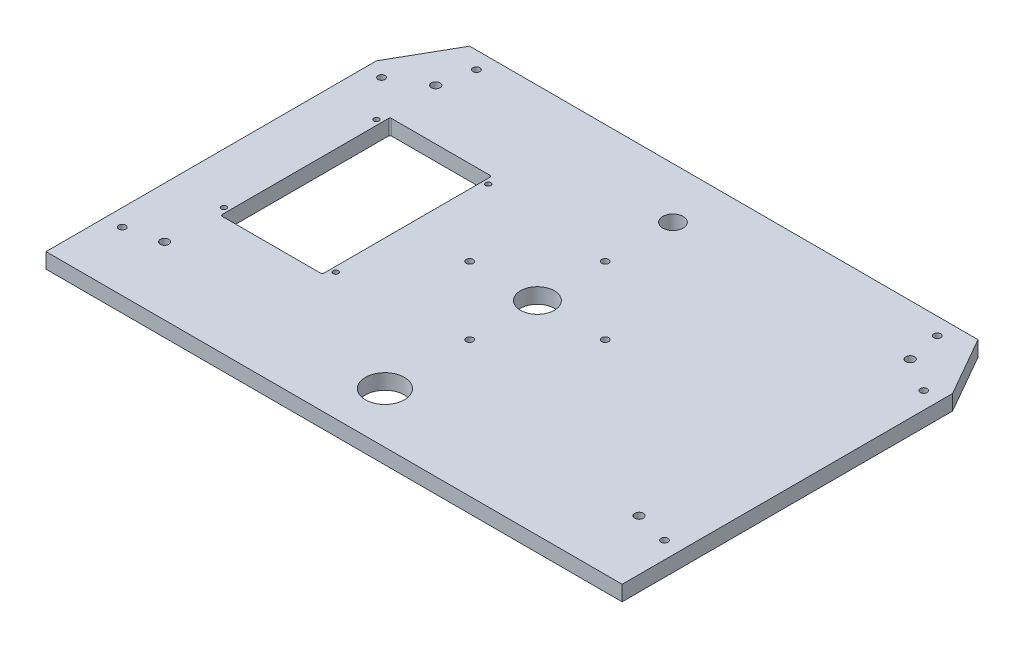
ISO-10303-21;
HEADER;
FILE_DESCRIPTION(('STEP AP214'),'2;1');
FILE_NAME('part.step','',(''),(''),'','','');
FILE_SCHEMA(('AUTOMOTIVE_DESIGN { 1 0 10303 214 1 1 1 1 }'));
ENDSEC;
DATA;
#1=APPLICATION_CONTEXT('core data for automotive mechanical design processes');
#2=APPLICATION_PROTOCOL_DEFINITION('international standard','automotive_design',2000,#1);
#3=PRODUCT_CONTEXT('',#1,'mechanical');
#4=PRODUCT('Part','Part','',(#3));
#5=PRODUCT_RELATED_PRODUCT_CATEGORY('part','',(#4));
#6=PRODUCT_DEFINITION_FORMATION('','',#4);
#7=PRODUCT_DEFINITION_CONTEXT('part definition',#1,'design');
#8=PRODUCT_DEFINITION('design','',#6,#7);
#9=PRODUCT_DEFINITION_SHAPE('','',#8);
#10=(LENGTH_UNIT() NAMED_UNIT(*) SI_UNIT(.MILLI.,.METRE.));
#11=(NAMED_UNIT(*) PLANE_ANGLE_UNIT() SI_UNIT($,.RADIAN.));
#12=(NAMED_UNIT(*) SI_UNIT($,.STERADIAN.) SOLID_ANGLE_UNIT());
#13=UNCERTAINTY_MEASURE_WITH_UNIT(LENGTH_MEASURE(1.E-05),#10,'distance_accuracy_value','');
#14=(GEOMETRIC_REPRESENTATION_CONTEXT(3) GLOBAL_UNCERTAINTY_ASSIGNED_CONTEXT((#13)) GLOBAL_UNIT_ASSIGNED_CONTEXT((#10,
#11,#12)) REPRESENTATION_CONTEXT('',''));
#15=CARTESIAN_POINT('',(0.,0.,0.));
#16=DIRECTION('',(0.,0.,1.));
#17=DIRECTION('',(1.,0.,0.));
#18=AXIS2_PLACEMENT_3D('',#15,#16,#17);
#19=CARTESIAN_POINT('',(-170.,-9.,0.));
#20=DIRECTION('',(-1.,0.,0.));
#21=DIRECTION('',(0.,0.,1.));
#22=AXIS2_PLACEMENT_3D('',#19,#20,#21);
#23=PLANE('',#22);
#24=DIRECTION('',(0.,0.,1.));
#25=VECTOR('',#24,1.);
#26=CARTESIAN_POINT('',(-170.,0.,0.));
#27=LINE('',#26,#25);
#28=CARTESIAN_POINT('',(-170.,0.,-75.));
#29=VERTEX_POINT('',#28);
#30=CARTESIAN_POINT('',(-170.,0.,120.));
#31=VERTEX_POINT('',#30);
#32=EDGE_CURVE('E371',#29,#31,#27,.T.);
#33=ORIENTED_EDGE('',*,*,#32,.F.);
#34=DIRECTION('',(0.,1.,0.));
#35=VECTOR('',#34,1.);
#36=CARTESIAN_POINT('',(-170.,-9.,-75.));
#37=LINE('',#36,#35);
#38=CARTESIAN_POINT('',(-170.,-9.,-75.));
#39=VERTEX_POINT('',#38);
#40=EDGE_CURVE('E13',#39,#29,#37,.T.);
#41=ORIENTED_EDGE('',*,*,#40,.F.);
#42=DIRECTION('',(0.,0.,1.));
#43=VECTOR('',#42,1.);
#44=CARTESIAN_POINT('',(-170.,-9.,0.));
#45=LINE('',#44,#43);
#46=CARTESIAN_POINT('',(-170.,-9.,120.));
#47=VERTEX_POINT('',#46);
#48=EDGE_CURVE('E343',#39,#47,#45,.T.);
#49=ORIENTED_EDGE('',*,*,#48,.T.);
#50=DIRECTION('',(0.,1.,0.));
#51=VECTOR('',#50,1.);
#52=CARTESIAN_POINT('',(-170.,-9.,120.));
#53=LINE('',#52,#51);
#54=EDGE_CURVE('E89',#47,#31,#53,.T.);
#55=ORIENTED_EDGE('',*,*,#54,.T.);
#56=EDGE_LOOP('',(#33,#41,#49,#55));
#57=FACE_BOUND('',#56,.T.);
#58=ADVANCED_FACE('F85',(#57),#23,.T.);
#59=CARTESIAN_POINT('',(-160.461538461538,-9.,-91.6923076923079));
#60=DIRECTION('',(0.868243142124459,0.,0.496138938356835));
#61=DIRECTION('',(0.496138938356835,0.,-0.868243142124459));
#62=AXIS2_PLACEMENT_3D('',#59,#60,#61);
#63=PLANE('',#62);
#64=DIRECTION('',(0.496138938356835,0.,-0.868243142124459));
#65=VECTOR('',#64,1.);
#66=CARTESIAN_POINT('',(-160.461538461538,0.,-91.6923076923079));
#67=LINE('',#66,#65);
#68=CARTESIAN_POINT('',(-150.,0.,-110.));
#69=VERTEX_POINT('',#68);
#70=EDGE_CURVE('E386',#29,#69,#67,.T.);
#71=ORIENTED_EDGE('',*,*,#70,.T.);
#72=DIRECTION('',(0.,1.,0.));
#73=VECTOR('',#72,1.);
#74=CARTESIAN_POINT('',(-150.,-9.,-110.));
#75=LINE('',#74,#73);
#76=CARTESIAN_POINT('',(-150.,-9.,-110.));
#77=VERTEX_POINT('',#76);
#78=EDGE_CURVE('E94',#77,#69,#75,.T.);
#79=ORIENTED_EDGE('',*,*,#78,.F.);
#80=DIRECTION('',(0.496138938356835,0.,-0.868243142124459));
#81=VECTOR('',#80,1.);
#82=CARTESIAN_POINT('',(-160.461538461538,-9.,-91.6923076923079));
#83=LINE('',#82,#81);
#84=EDGE_CURVE('E358',#39,#77,#83,.T.);
#85=ORIENTED_EDGE('',*,*,#84,.F.);
#86=ORIENTED_EDGE('',*,*,#40,.T.);
#87=EDGE_LOOP('',(#71,#79,#85,#86));
#88=FACE_BOUND('',#87,.T.);
#89=ADVANCED_FACE('F414',(#88),#63,.F.);
#90=CARTESIAN_POINT('',(0.,-9.,-110.));
#91=DIRECTION('',(0.,0.,-1.));
#92=DIRECTION('',(-1.,0.,0.));
#93=AXIS2_PLACEMENT_3D('',#90,#91,#92);
#94=PLANE('',#93);
#95=DIRECTION('',(-1.,0.,0.));
#96=VECTOR('',#95,1.);
#97=CARTESIAN_POINT('',(0.,0.,-110.));
#98=LINE('',#97,#96);
#99=CARTESIAN_POINT('',(150.,0.,-110.));
#100=VERTEX_POINT('',#99);
#101=EDGE_CURVE('E383',#100,#69,#98,.T.);
#102=ORIENTED_EDGE('',*,*,#101,.F.);
#103=DIRECTION('',(0.,1.,0.));
#104=VECTOR('',#103,1.);
#105=CARTESIAN_POINT('',(150.,-9.,-110.));
#106=LINE('',#105,#104);
#107=CARTESIAN_POINT('',(150.,-9.,-110.));
#108=VERTEX_POINT('',#107);
#109=EDGE_CURVE('E395',#108,#100,#106,.T.);
#110=ORIENTED_EDGE('',*,*,#109,.F.);
#111=DIRECTION('',(-1.,0.,0.));
#112=VECTOR('',#111,1.);
#113=CARTESIAN_POINT('',(0.,-9.,-110.));
#114=LINE('',#113,#112);
#115=EDGE_CURVE('E355',#108,#77,#114,.T.);
#116=ORIENTED_EDGE('',*,*,#115,.T.);
#117=ORIENTED_EDGE('',*,*,#78,.T.);
#118=EDGE_LOOP('',(#102,#110,#116,#117));
#119=FACE_BOUND('',#118,.T.);
#120=ADVANCED_FACE('F427',(#119),#94,.T.);
#121=CARTESIAN_POINT('',(160.461538461538,-9.,-91.6923076923079));
#122=DIRECTION('',(0.868243142124459,0.,-0.496138938356835));
#123=DIRECTION('',(-0.496138938356835,0.,-0.868243142124459));
#124=AXIS2_PLACEMENT_3D('',#121,#122,#123);
#125=PLANE('',#124);
#126=DIRECTION('',(-0.496138938356835,0.,-0.868243142124459));
#127=VECTOR('',#126,1.);
#128=CARTESIAN_POINT('',(160.461538461538,0.,-91.6923076923079));
#129=LINE('',#128,#127);
#130=CARTESIAN_POINT('',(170.,0.,-75.));
#131=VERTEX_POINT('',#130);
#132=EDGE_CURVE('E380',#131,#100,#129,.T.);
#133=ORIENTED_EDGE('',*,*,#132,.F.);
#134=DIRECTION('',(0.,1.,0.));
#135=VECTOR('',#134,1.);
#136=CARTESIAN_POINT('',(170.,-9.,-75.));
#137=LINE('',#136,#135);
#138=CARTESIAN_POINT('',(170.,-9.,-75.));
#139=VERTEX_POINT('',#138);
#140=EDGE_CURVE('E397',#139,#131,#137,.T.);
#141=ORIENTED_EDGE('',*,*,#140,.F.);
#142=DIRECTION('',(-0.496138938356835,0.,-0.868243142124459));
#143=VECTOR('',#142,1.);
#144=CARTESIAN_POINT('',(160.461538461538,-9.,-91.6923076923079));
#145=LINE('',#144,#143);
#146=EDGE_CURVE('E352',#139,#108,#145,.T.);
#147=ORIENTED_EDGE('',*,*,#146,.T.);
#148=ORIENTED_EDGE('',*,*,#109,.T.);
#149=EDGE_LOOP('',(#133,#141,#147,#148));
#150=FACE_BOUND('',#149,.T.);
#151=ADVANCED_FACE('F425',(#150),#125,.T.);
#152=CARTESIAN_POINT('',(170.,-9.,0.));
#153=DIRECTION('',(1.,0.,0.));
#154=DIRECTION('',(0.,0.,-1.));
#155=AXIS2_PLACEMENT_3D('',#152,#153,#154);
#156=PLANE('',#155);
#157=DIRECTION('',(0.,0.,-1.));
#158=VECTOR('',#157,1.);
#159=CARTESIAN_POINT('',(170.,0.,0.));
#160=LINE('',#159,#158);
#161=CARTESIAN_POINT('',(170.,0.,120.));
#162=VERTEX_POINT('',#161);
#163=EDGE_CURVE('E377',#162,#131,#160,.T.);
#164=ORIENTED_EDGE('',*,*,#163,.F.);
#165=DIRECTION('',(0.,1.,0.));
#166=VECTOR('',#165,1.);
#167=CARTESIAN_POINT('',(170.,-9.,120.));
#168=LINE('',#167,#166);
#169=CARTESIAN_POINT('',(170.,-9.,120.));
#170=VERTEX_POINT('',#169);
#171=EDGE_CURVE('E398',#170,#162,#168,.T.);
#172=ORIENTED_EDGE('',*,*,#171,.F.);
#173=DIRECTION('',(0.,0.,-1.));
#174=VECTOR('',#173,1.);
#175=CARTESIAN_POINT('',(170.,-9.,0.));
#176=LINE('',#175,#174);
#177=EDGE_CURVE('E349',#170,#139,#176,.T.);
#178=ORIENTED_EDGE('',*,*,#177,.T.);
#179=ORIENTED_EDGE('',*,*,#140,.T.);
#180=EDGE_LOOP('',(#164,#172,#178,#179));
#181=FACE_BOUND('',#180,.T.);
#182=ADVANCED_FACE('F422',(#181),#156,.T.);
#183=CARTESIAN_POINT('',(140.,-9.,80.));
#184=DIRECTION('',(0.,1.,0.));
#185=DIRECTION('',(0.,0.,1.));
#186=AXIS2_PLACEMENT_3D('',#183,#184,#185);
#187=CYLINDRICAL_SURFACE('',#186,2.54999999999999);
#188=CARTESIAN_POINT('',(140.,-9.,80.));
#189=DIRECTION('',(0.,1.,0.));
#190=DIRECTION('',(0.,0.,1.));
#191=AXIS2_PLACEMENT_3D('',#188,#189,#190);
#192=CIRCLE('',#191,2.54999999999999);
#193=CARTESIAN_POINT('',(140.,-9.,82.55));
#194=VERTEX_POINT('',#193);
#195=EDGE_CURVE('E360',#194,#194,#192,.T.);
#196=ORIENTED_EDGE('',*,*,#195,.F.);
#197=EDGE_LOOP('',(#196));
#198=FACE_BOUND('',#197,.T.);
#199=CARTESIAN_POINT('',(140.,0.,80.));
#200=DIRECTION('',(0.,1.,0.));
#201=DIRECTION('',(0.,0.,1.));
#202=AXIS2_PLACEMENT_3D('',#199,#200,#201);
#203=CIRCLE('',#202,2.54999999999999);
#204=CARTESIAN_POINT('',(140.,0.,82.55));
#205=VERTEX_POINT('',#204);
#206=EDGE_CURVE('E389',#205,#205,#203,.T.);
#207=ORIENTED_EDGE('',*,*,#206,.T.);
#208=EDGE_LOOP('',(#207));
#209=FACE_BOUND('',#208,.T.);
#210=ADVANCED_FACE('F451',(#198,#209),#187,.F.);
#211=CARTESIAN_POINT('',(0.,-9.,120.));
#212=DIRECTION('',(0.,0.,1.));
#213=DIRECTION('',(1.,0.,0.));
#214=AXIS2_PLACEMENT_3D('',#211,#212,#213);
#215=PLANE('',#214);
#216=DIRECTION('',(1.,0.,0.));
#217=VECTOR('',#216,1.);
#218=CARTESIAN_POINT('',(0.,0.,120.));
#219=LINE('',#218,#217);
#220=EDGE_CURVE('E374',#31,#162,#219,.T.);
#221=ORIENTED_EDGE('',*,*,#220,.F.);
#222=ORIENTED_EDGE('',*,*,#54,.F.);
#223=DIRECTION('',(1.,0.,0.));
#224=VECTOR('',#223,1.);
#225=CARTESIAN_POINT('',(0.,-9.,120.));
#226=LINE('',#225,#224);
#227=EDGE_CURVE('E346',#47,#170,#226,.T.);
#228=ORIENTED_EDGE('',*,*,#227,.T.);
#229=ORIENTED_EDGE('',*,*,#171,.T.);
#230=EDGE_LOOP('',(#221,#222,#228,#229));
#231=FACE_BOUND('',#230,.T.);
#232=ADVANCED_FACE('F406',(#231),#215,.T.);
#233=CARTESIAN_POINT('',(-140.,-9.,-80.));
#234=DIRECTION('',(0.,1.,0.));
#235=DIRECTION('',(0.,0.,1.));
#236=AXIS2_PLACEMENT_3D('',#233,#234,#235);
#237=CYLINDRICAL_SURFACE('',#236,2.54999999999999);
#238=CARTESIAN_POINT('',(-140.,-9.,-80.));
#239=DIRECTION('',(0.,1.,0.));
#240=DIRECTION('',(0.,0.,1.));
#241=AXIS2_PLACEMENT_3D('',#238,#239,#240);
#242=CIRCLE('',#241,2.54999999999999);
#243=CARTESIAN_POINT('',(-140.,-9.,-77.45));
#244=VERTEX_POINT('',#243);
#245=EDGE_CURVE('E339',#244,#244,#242,.T.);
#246=ORIENTED_EDGE('',*,*,#245,.F.);
#247=EDGE_LOOP('',(#246));
#248=FACE_BOUND('',#247,.T.);
#249=CARTESIAN_POINT('',(-140.,0.,-80.));
#250=DIRECTION('',(0.,1.,0.));
#251=DIRECTION('',(0.,0.,1.));
#252=AXIS2_PLACEMENT_3D('',#249,#250,#251);
#253=CIRCLE('',#252,2.54999999999999);
#254=CARTESIAN_POINT('',(-140.,0.,-77.45));
#255=VERTEX_POINT('',#254);
#256=EDGE_CURVE('E368',#255,#255,#253,.T.);
#257=ORIENTED_EDGE('',*,*,#256,.T.);
#258=EDGE_LOOP('',(#257));
#259=FACE_BOUND('',#258,.T.);
#260=ADVANCED_FACE('F442',(#248,#259),#237,.F.);
#261=CARTESIAN_POINT('',(-140.,-9.,80.));
#262=DIRECTION('',(0.,1.,0.));
#263=DIRECTION('',(0.,0.,1.));
#264=AXIS2_PLACEMENT_3D('',#261,#262,#263);
#265=CYLINDRICAL_SURFACE('',#264,2.54999999999999);
#266=CARTESIAN_POINT('',(-140.,-9.,80.));
#267=DIRECTION('',(0.,1.,0.));
#268=DIRECTION('',(0.,0.,1.));
#269=AXIS2_PLACEMENT_3D('',#266,#267,#268);
#270=CIRCLE('',#269,2.54999999999999);
#271=CARTESIAN_POINT('',(-140.,-9.,82.55));
#272=VERTEX_POINT('',#271);
#273=EDGE_CURVE('E336',#272,#272,#270,.F.);
#274=ORIENTED_EDGE('',*,*,#273,.T.);
#275=EDGE_LOOP('',(#274));
#276=FACE_BOUND('',#275,.T.);
#277=CARTESIAN_POINT('',(-140.,0.,80.));
#278=DIRECTION('',(0.,1.,0.));
#279=DIRECTION('',(0.,0.,1.));
#280=AXIS2_PLACEMENT_3D('',#277,#278,#279);
#281=CIRCLE('',#280,2.54999999999999);
#282=CARTESIAN_POINT('',(-140.,0.,82.55));
#283=VERTEX_POINT('',#282);
#284=EDGE_CURVE('E335',#283,#283,#281,.F.);
#285=ORIENTED_EDGE('',*,*,#284,.F.);
#286=EDGE_LOOP('',(#285));
#287=FACE_BOUND('',#286,.T.);
#288=ADVANCED_FACE('F87',(#276,#287),#265,.F.);
#289=CARTESIAN_POINT('',(140.,-9.,-80.));
#290=DIRECTION('',(0.,1.,0.));
#291=DIRECTION('',(0.,0.,1.));
#292=AXIS2_PLACEMENT_3D('',#289,#290,#291);
#293=CYLINDRICAL_SURFACE('',#292,2.54999999999999);
#294=CARTESIAN_POINT('',(140.,-9.,-80.));
#295=DIRECTION('',(0.,1.,0.));
#296=DIRECTION('',(0.,0.,1.));
#297=AXIS2_PLACEMENT_3D('',#294,#295,#296);
#298=CIRCLE('',#297,2.54999999999999);
#299=CARTESIAN_POINT('',(140.,-9.,-77.45));
#300=VERTEX_POINT('',#299);
#301=EDGE_CURVE('E363',#300,#300,#298,.F.);
#302=ORIENTED_EDGE('',*,*,#301,.T.);
#303=EDGE_LOOP('',(#302));
#304=FACE_BOUND('',#303,.T.);
#305=CARTESIAN_POINT('',(140.,0.,-80.));
#306=DIRECTION('',(0.,1.,0.));
#307=DIRECTION('',(0.,0.,1.));
#308=AXIS2_PLACEMENT_3D('',#305,#306,#307);
#309=CIRCLE('',#308,2.54999999999999);
#310=CARTESIAN_POINT('',(140.,0.,-77.45));
#311=VERTEX_POINT('',#310);
#312=EDGE_CURVE('E340',#311,#311,#309,.F.);
#313=ORIENTED_EDGE('',*,*,#312,.F.);
#314=EDGE_LOOP('',(#313));
#315=FACE_BOUND('',#314,.T.);
#316=ADVANCED_FACE('F449',(#304,#315),#293,.F.);
#317=CARTESIAN_POINT('',(0.,-9.,0.));
#318=DIRECTION('',(0.,1.,0.));
#319=DIRECTION('',(0.,0.,1.));
#320=AXIS2_PLACEMENT_3D('',#317,#318,#319);
#321=PLANE('',#320);
#322=CARTESIAN_POINT('',(-74.,-9.,45.));
#323=DIRECTION('',(0.,1.,0.));
#324=DIRECTION('',(0.,0.,1.));
#325=AXIS2_PLACEMENT_3D('',#322,#323,#324);
#326=CIRCLE('',#325,1.54999999999999);
#327=CARTESIAN_POINT('',(-74.,-9.,46.55));
#328=VERTEX_POINT('',#327);
#329=EDGE_CURVE('E819',#328,#328,#326,.T.);
#330=ORIENTED_EDGE('',*,*,#329,.T.);
#331=EDGE_LOOP('',(#330));
#332=FACE_BOUND('',#331,.T.);
#333=CARTESIAN_POINT('',(-74.,-9.,-45.));
#334=DIRECTION('',(0.,1.,0.));
#335=DIRECTION('',(0.,0.,1.));
#336=AXIS2_PLACEMENT_3D('',#333,#334,#335);
#337=CIRCLE('',#336,1.54999999999999);
#338=CARTESIAN_POINT('',(-74.,-9.,-43.45));
#339=VERTEX_POINT('',#338);
#340=EDGE_CURVE('E822',#339,#339,#337,.T.);
#341=ORIENTED_EDGE('',*,*,#340,.T.);
#342=EDGE_LOOP('',(#341));
#343=FACE_BOUND('',#342,.T.);
#344=CARTESIAN_POINT('',(-140.,-9.,-45.));
#345=DIRECTION('',(0.,1.,0.));
#346=DIRECTION('',(0.,0.,1.));
#347=AXIS2_PLACEMENT_3D('',#344,#345,#346);
#348=CIRCLE('',#347,1.54999999999999);
#349=CARTESIAN_POINT('',(-140.,-9.,-43.45));
#350=VERTEX_POINT('',#349);
#351=EDGE_CURVE('E830',#350,#350,#348,.T.);
#352=ORIENTED_EDGE('',*,*,#351,.T.);
#353=EDGE_LOOP('',(#352));
#354=FACE_BOUND('',#353,.T.);
#355=CARTESIAN_POINT('',(-140.,-9.,45.));
#356=DIRECTION('',(0.,1.,0.));
#357=DIRECTION('',(0.,0.,1.));
#358=AXIS2_PLACEMENT_3D('',#355,#356,#357);
#359=CIRCLE('',#358,1.54999999999999);
#360=CARTESIAN_POINT('',(-140.,-9.,46.55));
#361=VERTEX_POINT('',#360);
#362=EDGE_CURVE('E836',#361,#361,#359,.T.);
#363=ORIENTED_EDGE('',*,*,#362,.T.);
#364=EDGE_LOOP('',(#363));
#365=FACE_BOUND('',#364,.T.);
#366=DIRECTION('',(0.,0.,-1.));
#367=VECTOR('',#366,1.);
#368=CARTESIAN_POINT('',(-77.,-9.,0.));
#369=LINE('',#368,#367);
#370=CARTESIAN_POINT('',(-77.,-9.,49.));
#371=VERTEX_POINT('',#370);
#372=CARTESIAN_POINT('',(-77.,-9.,-49.));
#373=VERTEX_POINT('',#372);
#374=EDGE_CURVE('E221',#371,#373,#369,.T.);
#375=ORIENTED_EDGE('',*,*,#374,.T.);
#376=CARTESIAN_POINT('',(-78.,-9.,-49.));
#377=DIRECTION('',(0.,1.,0.));
#378=DIRECTION('',(0.,0.,1.));
#379=AXIS2_PLACEMENT_3D('',#376,#377,#378);
#380=CIRCLE('',#379,1.);
#381=CARTESIAN_POINT('',(-78.,-9.,-50.));
#382=VERTEX_POINT('',#381);
#383=EDGE_CURVE('E223',#373,#382,#380,.T.);
#384=ORIENTED_EDGE('',*,*,#383,.T.);
#385=DIRECTION('',(-1.,0.,0.));
#386=VECTOR('',#385,1.);
#387=CARTESIAN_POINT('',(0.,-9.,-50.));
#388=LINE('',#387,#386);
#389=CARTESIAN_POINT('',(-136.,-9.,-50.));
#390=VERTEX_POINT('',#389);
#391=EDGE_CURVE('E210',#382,#390,#388,.T.);
#392=ORIENTED_EDGE('',*,*,#391,.T.);
#393=CARTESIAN_POINT('',(-136.,-9.,-49.));
#394=DIRECTION('',(0.,1.,0.));
#395=DIRECTION('',(0.,0.,1.));
#396=AXIS2_PLACEMENT_3D('',#393,#394,#395);
#397=CIRCLE('',#396,1.);
#398=CARTESIAN_POINT('',(-137.,-9.,-49.));
#399=VERTEX_POINT('',#398);
#400=EDGE_CURVE('E102',#390,#399,#397,.T.);
#401=ORIENTED_EDGE('',*,*,#400,.T.);
#402=DIRECTION('',(0.,0.,-1.));
#403=VECTOR('',#402,1.);
#404=CARTESIAN_POINT('',(-137.,-9.,0.));
#405=LINE('',#404,#403);
#406=CARTESIAN_POINT('',(-137.,-9.,49.));
#407=VERTEX_POINT('',#406);
#408=EDGE_CURVE('E188',#407,#399,#405,.T.);
#409=ORIENTED_EDGE('',*,*,#408,.F.);
#410=CARTESIAN_POINT('',(-136.,-9.,49.));
#411=DIRECTION('',(0.,1.,0.));
#412=DIRECTION('',(0.,0.,1.));
#413=AXIS2_PLACEMENT_3D('',#410,#411,#412);
#414=CIRCLE('',#413,1.);
#415=CARTESIAN_POINT('',(-136.,-9.,50.));
#416=VERTEX_POINT('',#415);
#417=EDGE_CURVE('E196',#416,#407,#414,.F.);
#418=ORIENTED_EDGE('',*,*,#417,.F.);
#419=DIRECTION('',(-1.,0.,0.));
#420=VECTOR('',#419,1.);
#421=CARTESIAN_POINT('',(0.,-9.,50.));
#422=LINE('',#421,#420);
#423=CARTESIAN_POINT('',(-78.,-9.,50.));
#424=VERTEX_POINT('',#423);
#425=EDGE_CURVE('E216',#424,#416,#422,.T.);
#426=ORIENTED_EDGE('',*,*,#425,.F.);
#427=CARTESIAN_POINT('',(-78.,-9.,49.));
#428=DIRECTION('',(0.,1.,0.));
#429=DIRECTION('',(0.,0.,1.));
#430=AXIS2_PLACEMENT_3D('',#427,#428,#429);
#431=CIRCLE('',#430,1.);
#432=EDGE_CURVE('E218',#424,#371,#431,.T.);
#433=ORIENTED_EDGE('',*,*,#432,.T.);
#434=EDGE_LOOP('',(#375,#384,#392,#401,#409,#418,#426,#433));
#435=FACE_BOUND('',#434,.T.);
#436=CARTESIAN_POINT('',(-136.,-9.,-100.));
#437=DIRECTION('',(0.,1.,0.));
#438=DIRECTION('',(0.,0.,1.));
#439=AXIS2_PLACEMENT_3D('',#436,#437,#438);
#440=CIRCLE('',#439,2.04999999999999);
#441=CARTESIAN_POINT('',(-136.,-9.,-97.95));
#442=VERTEX_POINT('',#441);
#443=EDGE_CURVE('E290',#442,#442,#440,.T.);
#444=ORIENTED_EDGE('',*,*,#443,.T.);
#445=EDGE_LOOP('',(#444));
#446=FACE_BOUND('',#445,.T.);
#447=CARTESIAN_POINT('',(-160.,-9.,-68.));
#448=DIRECTION('',(0.,1.,0.));
#449=DIRECTION('',(0.,0.,1.));
#450=AXIS2_PLACEMENT_3D('',#447,#448,#449);
#451=CIRCLE('',#450,2.04999999999999);
#452=CARTESIAN_POINT('',(-160.,-9.,-65.95));
#453=VERTEX_POINT('',#452);
#454=EDGE_CURVE('E287',#453,#453,#451,.T.);
#455=ORIENTED_EDGE('',*,*,#454,.T.);
#456=EDGE_LOOP('',(#455));
#457=FACE_BOUND('',#456,.T.);
#458=CARTESIAN_POINT('',(-160.,-9.,85.));
#459=DIRECTION('',(0.,1.,0.));
#460=DIRECTION('',(0.,0.,1.));
#461=AXIS2_PLACEMENT_3D('',#458,#459,#460);
#462=CIRCLE('',#461,2.04999999999999);
#463=CARTESIAN_POINT('',(-160.,-9.,87.05));
#464=VERTEX_POINT('',#463);
#465=EDGE_CURVE('E284',#464,#464,#462,.T.);
#466=ORIENTED_EDGE('',*,*,#465,.T.);
#467=EDGE_LOOP('',(#466));
#468=FACE_BOUND('',#467,.T.);
#469=CARTESIAN_POINT('',(136.,-9.,-100.));
#470=DIRECTION('',(0.,1.,0.));
#471=DIRECTION('',(0.,0.,1.));
#472=AXIS2_PLACEMENT_3D('',#469,#470,#471);
#473=CIRCLE('',#472,2.04999999999999);
#474=CARTESIAN_POINT('',(136.,-9.,-97.95));
#475=VERTEX_POINT('',#474);
#476=EDGE_CURVE('E281',#475,#475,#473,.T.);
#477=ORIENTED_EDGE('',*,*,#476,.T.);
#478=EDGE_LOOP('',(#477));
#479=FACE_BOUND('',#478,.T.);
#480=CARTESIAN_POINT('',(160.,-9.,-68.));
#481=DIRECTION('',(0.,1.,0.));
#482=DIRECTION('',(0.,0.,1.));
#483=AXIS2_PLACEMENT_3D('',#480,#481,#482);
#484=CIRCLE('',#483,2.04999999999999);
#485=CARTESIAN_POINT('',(160.,-9.,-65.95));
#486=VERTEX_POINT('',#485);
#487=EDGE_CURVE('E278',#486,#486,#484,.T.);
#488=ORIENTED_EDGE('',*,*,#487,.T.);
#489=EDGE_LOOP('',(#488));
#490=FACE_BOUND('',#489,.T.);
#491=CARTESIAN_POINT('',(160.,-9.,85.));
#492=DIRECTION('',(0.,1.,0.));
#493=DIRECTION('',(0.,0.,1.));
#494=AXIS2_PLACEMENT_3D('',#491,#492,#493);
#495=CIRCLE('',#494,2.04999999999999);
#496=CARTESIAN_POINT('',(160.,-9.,87.05));
#497=VERTEX_POINT('',#496);
#498=EDGE_CURVE('E270',#497,#497,#495,.T.);
#499=ORIENTED_EDGE('',*,*,#498,.T.);
#500=EDGE_LOOP('',(#499));
#501=FACE_BOUND('',#500,.T.);
#502=CARTESIAN_POINT('',(40.,-9.,0.));
#503=DIRECTION('',(0.,1.,0.));
#504=DIRECTION('',(0.,0.,1.));
#505=AXIS2_PLACEMENT_3D('',#502,#503,#504);
#506=CIRCLE('',#505,2.05);
#507=CARTESIAN_POINT('',(40.,-9.,2.05));
#508=VERTEX_POINT('',#507);
#509=EDGE_CURVE('E332',#508,#508,#506,.T.);
#510=ORIENTED_EDGE('',*,*,#509,.T.);
#511=EDGE_LOOP('',(#510));
#512=FACE_BOUND('',#511,.T.);
#513=CARTESIAN_POINT('',(0.,-9.,-80.));
#514=DIRECTION('',(0.,1.,0.));
#515=DIRECTION('',(0.,0.,1.));
#516=AXIS2_PLACEMENT_3D('',#513,#514,#515);
#517=CIRCLE('',#516,6.);
#518=CARTESIAN_POINT('',(0.,-9.,-74.));
#519=VERTEX_POINT('',#518);
#520=EDGE_CURVE('E329',#519,#519,#517,.T.);
#521=ORIENTED_EDGE('',*,*,#520,.T.);
#522=EDGE_LOOP('',(#521));
#523=FACE_BOUND('',#522,.T.);
#524=CARTESIAN_POINT('',(0.,-9.,-40.0000000000001));
#525=DIRECTION('',(0.,1.,0.));
#526=DIRECTION('',(0.,0.,1.));
#527=AXIS2_PLACEMENT_3D('',#524,#525,#526);
#528=CIRCLE('',#527,2.05);
#529=CARTESIAN_POINT('',(0.,-9.,-37.9500000000001));
#530=VERTEX_POINT('',#529);
#531=EDGE_CURVE('E326',#530,#530,#528,.T.);
#532=ORIENTED_EDGE('',*,*,#531,.T.);
#533=EDGE_LOOP('',(#532));
#534=FACE_BOUND('',#533,.T.);
#535=CARTESIAN_POINT('',(0.,-9.,90.));
#536=DIRECTION('',(0.,1.,0.));
#537=DIRECTION('',(0.,0.,1.));
#538=AXIS2_PLACEMENT_3D('',#535,#536,#537);
#539=CIRCLE('',#538,11.5);
#540=CARTESIAN_POINT('',(0.,-9.,101.5));
#541=VERTEX_POINT('',#540);
#542=EDGE_CURVE('E323',#541,#541,#539,.T.);
#543=ORIENTED_EDGE('',*,*,#542,.T.);
#544=EDGE_LOOP('',(#543));
#545=FACE_BOUND('',#544,.T.);
#546=CARTESIAN_POINT('',(0.,-9.,40.));
#547=DIRECTION('',(0.,1.,0.));
#548=DIRECTION('',(0.,0.,1.));
#549=AXIS2_PLACEMENT_3D('',#546,#547,#548);
#550=CIRCLE('',#549,2.05);
#551=CARTESIAN_POINT('',(0.,-9.,42.05));
#552=VERTEX_POINT('',#551);
#553=EDGE_CURVE('E320',#552,#552,#550,.T.);
#554=ORIENTED_EDGE('',*,*,#553,.T.);
#555=EDGE_LOOP('',(#554));
#556=FACE_BOUND('',#555,.T.);
#557=CARTESIAN_POINT('',(-40.0000000000001,-9.,0.));
#558=DIRECTION('',(0.,1.,0.));
#559=DIRECTION('',(0.,0.,1.));
#560=AXIS2_PLACEMENT_3D('',#557,#558,#559);
#561=CIRCLE('',#560,2.05);
#562=CARTESIAN_POINT('',(-40.0000000000001,-9.,2.05));
#563=VERTEX_POINT('',#562);
#564=EDGE_CURVE('E317',#563,#563,#561,.T.);
#565=ORIENTED_EDGE('',*,*,#564,.T.);
#566=EDGE_LOOP('',(#565));
#567=FACE_BOUND('',#566,.T.);
#568=CARTESIAN_POINT('',(0.,-9.,0.));
#569=DIRECTION('',(0.,1.,0.));
#570=DIRECTION('',(0.,0.,1.));
#571=AXIS2_PLACEMENT_3D('',#568,#569,#570);
#572=CIRCLE('',#571,10.);
#573=CARTESIAN_POINT('',(0.,-9.,10.));
#574=VERTEX_POINT('',#573);
#575=EDGE_CURVE('E314',#574,#574,#572,.T.);
#576=ORIENTED_EDGE('',*,*,#575,.T.);
#577=EDGE_LOOP('',(#576));
#578=FACE_BOUND('',#577,.T.);
#579=ORIENTED_EDGE('',*,*,#273,.F.);
#580=EDGE_LOOP('',(#579));
#581=FACE_BOUND('',#580,.T.);
#582=ORIENTED_EDGE('',*,*,#245,.T.);
#583=EDGE_LOOP('',(#582));
#584=FACE_BOUND('',#583,.T.);
#585=ORIENTED_EDGE('',*,*,#48,.F.);
#586=ORIENTED_EDGE('',*,*,#84,.T.);
#587=ORIENTED_EDGE('',*,*,#115,.F.);
#588=ORIENTED_EDGE('',*,*,#146,.F.);
#589=ORIENTED_EDGE('',*,*,#177,.F.);
#590=ORIENTED_EDGE('',*,*,#227,.F.);
#591=EDGE_LOOP('',(#585,#586,#587,#588,#589,#590));
#592=FACE_BOUND('',#591,.T.);
#593=ORIENTED_EDGE('',*,*,#195,.T.);
#594=EDGE_LOOP('',(#593));
#595=FACE_BOUND('',#594,.T.);
#596=ORIENTED_EDGE('',*,*,#301,.F.);
#597=EDGE_LOOP('',(#596));
#598=FACE_BOUND('',#597,.T.);
#599=ADVANCED_FACE('F206',(#332,#343,#354,#365,#435,#446,#457,#468,#479,#490,#501,#512,#523,
#534,#545,#556,#567,#578,#581,#584,#592,#595,#598),#321,.F.);
#600=CARTESIAN_POINT('',(0.,0.,0.));
#601=DIRECTION('',(0.,1.,0.));
#602=DIRECTION('',(0.,0.,1.));
#603=AXIS2_PLACEMENT_3D('',#600,#601,#602);
#604=PLANE('',#603);
#605=CARTESIAN_POINT('',(-74.,0.,45.));
#606=DIRECTION('',(0.,1.,0.));
#607=DIRECTION('',(0.,0.,1.));
#608=AXIS2_PLACEMENT_3D('',#605,#606,#607);
#609=CIRCLE('',#608,1.54999999999999);
#610=CARTESIAN_POINT('',(-74.,0.,46.55));
#611=VERTEX_POINT('',#610);
#612=EDGE_CURVE('E821',#611,#611,#609,.T.);
#613=ORIENTED_EDGE('',*,*,#612,.F.);
#614=EDGE_LOOP('',(#613));
#615=FACE_BOUND('',#614,.T.);
#616=CARTESIAN_POINT('',(-74.,0.,-45.));
#617=DIRECTION('',(0.,1.,0.));
#618=DIRECTION('',(0.,0.,1.));
#619=AXIS2_PLACEMENT_3D('',#616,#617,#618);
#620=CIRCLE('',#619,1.54999999999999);
#621=CARTESIAN_POINT('',(-74.,0.,-43.45));
#622=VERTEX_POINT('',#621);
#623=EDGE_CURVE('E825',#622,#622,#620,.T.);
#624=ORIENTED_EDGE('',*,*,#623,.F.);
#625=EDGE_LOOP('',(#624));
#626=FACE_BOUND('',#625,.T.);
#627=CARTESIAN_POINT('',(-140.,0.,-45.));
#628=DIRECTION('',(0.,1.,0.));
#629=DIRECTION('',(0.,0.,1.));
#630=AXIS2_PLACEMENT_3D('',#627,#628,#629);
#631=CIRCLE('',#630,1.54999999999999);
#632=CARTESIAN_POINT('',(-140.,0.,-43.45));
#633=VERTEX_POINT('',#632);
#634=EDGE_CURVE('E833',#633,#633,#631,.T.);
#635=ORIENTED_EDGE('',*,*,#634,.F.);
#636=EDGE_LOOP('',(#635));
#637=FACE_BOUND('',#636,.T.);
#638=CARTESIAN_POINT('',(-140.,0.,45.));
#639=DIRECTION('',(0.,1.,0.));
#640=DIRECTION('',(0.,0.,1.));
#641=AXIS2_PLACEMENT_3D('',#638,#639,#640);
#642=CIRCLE('',#641,1.54999999999999);
#643=CARTESIAN_POINT('',(-140.,0.,46.55));
#644=VERTEX_POINT('',#643);
#645=EDGE_CURVE('E228',#644,#644,#642,.T.);
#646=ORIENTED_EDGE('',*,*,#645,.F.);
#647=EDGE_LOOP('',(#646));
#648=FACE_BOUND('',#647,.T.);
#649=CARTESIAN_POINT('',(-78.,0.,-49.));
#650=DIRECTION('',(0.,1.,0.));
#651=DIRECTION('',(0.,0.,1.));
#652=AXIS2_PLACEMENT_3D('',#649,#650,#651);
#653=CIRCLE('',#652,1.);
#654=CARTESIAN_POINT('',(-77.,0.,-49.));
#655=VERTEX_POINT('',#654);
#656=CARTESIAN_POINT('',(-78.,0.,-50.));
#657=VERTEX_POINT('',#656);
#658=EDGE_CURVE('E110',#655,#657,#653,.T.);
#659=ORIENTED_EDGE('',*,*,#658,.F.);
#660=DIRECTION('',(0.,0.,-1.));
#661=VECTOR('',#660,1.);
#662=CARTESIAN_POINT('',(-77.,0.,0.));
#663=LINE('',#662,#661);
#664=CARTESIAN_POINT('',(-77.,0.,49.));
#665=VERTEX_POINT('',#664);
#666=EDGE_CURVE('E241',#665,#655,#663,.T.);
#667=ORIENTED_EDGE('',*,*,#666,.F.);
#668=CARTESIAN_POINT('',(-78.,0.,49.));
#669=DIRECTION('',(0.,1.,0.));
#670=DIRECTION('',(0.,0.,1.));
#671=AXIS2_PLACEMENT_3D('',#668,#669,#670);
#672=CIRCLE('',#671,1.);
#673=CARTESIAN_POINT('',(-78.,0.,50.));
#674=VERTEX_POINT('',#673);
#675=EDGE_CURVE('E238',#674,#665,#672,.T.);
#676=ORIENTED_EDGE('',*,*,#675,.F.);
#677=DIRECTION('',(-1.,0.,0.));
#678=VECTOR('',#677,1.);
#679=CARTESIAN_POINT('',(0.,0.,50.));
#680=LINE('',#679,#678);
#681=CARTESIAN_POINT('',(-136.,0.,50.));
#682=VERTEX_POINT('',#681);
#683=EDGE_CURVE('E235',#674,#682,#680,.T.);
#684=ORIENTED_EDGE('',*,*,#683,.T.);
#685=CARTESIAN_POINT('',(-136.,0.,49.));
#686=DIRECTION('',(0.,1.,0.));
#687=DIRECTION('',(0.,0.,1.));
#688=AXIS2_PLACEMENT_3D('',#685,#686,#687);
#689=CIRCLE('',#688,1.);
#690=CARTESIAN_POINT('',(-137.,0.,49.));
#691=VERTEX_POINT('',#690);
#692=EDGE_CURVE('E232',#682,#691,#689,.F.);
#693=ORIENTED_EDGE('',*,*,#692,.T.);
#694=DIRECTION('',(0.,0.,-1.));
#695=VECTOR('',#694,1.);
#696=CARTESIAN_POINT('',(-137.,0.,0.));
#697=LINE('',#696,#695);
#698=CARTESIAN_POINT('',(-137.,0.,-49.));
#699=VERTEX_POINT('',#698);
#700=EDGE_CURVE('E230',#691,#699,#697,.T.);
#701=ORIENTED_EDGE('',*,*,#700,.T.);
#702=CARTESIAN_POINT('',(-136.,0.,-49.));
#703=DIRECTION('',(0.,1.,0.));
#704=DIRECTION('',(0.,0.,1.));
#705=AXIS2_PLACEMENT_3D('',#702,#703,#704);
#706=CIRCLE('',#705,1.);
#707=CARTESIAN_POINT('',(-136.,0.,-50.));
#708=VERTEX_POINT('',#707);
#709=EDGE_CURVE('E200',#708,#699,#706,.T.);
#710=ORIENTED_EDGE('',*,*,#709,.F.);
#711=DIRECTION('',(-1.,0.,0.));
#712=VECTOR('',#711,1.);
#713=CARTESIAN_POINT('',(0.,0.,-50.));
#714=LINE('',#713,#712);
#715=EDGE_CURVE('E225',#657,#708,#714,.T.);
#716=ORIENTED_EDGE('',*,*,#715,.F.);
#717=EDGE_LOOP('',(#659,#667,#676,#684,#693,#701,#710,#716));
#718=FACE_BOUND('',#717,.T.);
#719=CARTESIAN_POINT('',(-136.,0.,-100.));
#720=DIRECTION('',(0.,1.,0.));
#721=DIRECTION('',(0.,0.,1.));
#722=AXIS2_PLACEMENT_3D('',#719,#720,#721);
#723=CIRCLE('',#722,2.04999999999999);
#724=CARTESIAN_POINT('',(-136.,0.,-97.95));
#725=VERTEX_POINT('',#724);
#726=EDGE_CURVE('E267',#725,#725,#723,.T.);
#727=ORIENTED_EDGE('',*,*,#726,.F.);
#728=EDGE_LOOP('',(#727));
#729=FACE_BOUND('',#728,.T.);
#730=CARTESIAN_POINT('',(-160.,0.,-68.));
#731=DIRECTION('',(0.,1.,0.));
#732=DIRECTION('',(0.,0.,1.));
#733=AXIS2_PLACEMENT_3D('',#730,#731,#732);
#734=CIRCLE('',#733,2.04999999999999);
#735=CARTESIAN_POINT('',(-160.,0.,-65.95));
#736=VERTEX_POINT('',#735);
#737=EDGE_CURVE('E271',#736,#736,#734,.T.);
#738=ORIENTED_EDGE('',*,*,#737,.F.);
#739=EDGE_LOOP('',(#738));
#740=FACE_BOUND('',#739,.T.);
#741=CARTESIAN_POINT('',(-160.,0.,85.));
#742=DIRECTION('',(0.,1.,0.));
#743=DIRECTION('',(0.,0.,1.));
#744=AXIS2_PLACEMENT_3D('',#741,#742,#743);
#745=CIRCLE('',#744,2.04999999999999);
#746=CARTESIAN_POINT('',(-160.,0.,87.05));
#747=VERTEX_POINT('',#746);
#748=EDGE_CURVE('E264',#747,#747,#745,.T.);
#749=ORIENTED_EDGE('',*,*,#748,.F.);
#750=EDGE_LOOP('',(#749));
#751=FACE_BOUND('',#750,.T.);
#752=CARTESIAN_POINT('',(136.,0.,-100.));
#753=DIRECTION('',(0.,1.,0.));
#754=DIRECTION('',(0.,0.,-1.));
#755=AXIS2_PLACEMENT_3D('',#752,#753,#754);
#756=CIRCLE('',#755,2.04999999999999);
#757=CARTESIAN_POINT('',(136.,0.,-102.05));
#758=VERTEX_POINT('',#757);
#759=EDGE_CURVE('E247',#758,#758,#756,.T.);
#760=ORIENTED_EDGE('',*,*,#759,.F.);
#761=EDGE_LOOP('',(#760));
#762=FACE_BOUND('',#761,.T.);
#763=CARTESIAN_POINT('',(160.,0.,-68.));
#764=DIRECTION('',(0.,1.,0.));
#765=DIRECTION('',(0.,0.,-1.));
#766=AXIS2_PLACEMENT_3D('',#763,#764,#765);
#767=CIRCLE('',#766,2.04999999999999);
#768=CARTESIAN_POINT('',(160.,0.,-70.05));
#769=VERTEX_POINT('',#768);
#770=EDGE_CURVE('E260',#769,#769,#767,.T.);
#771=ORIENTED_EDGE('',*,*,#770,.F.);
#772=EDGE_LOOP('',(#771));
#773=FACE_BOUND('',#772,.T.);
#774=CARTESIAN_POINT('',(160.,0.,85.));
#775=DIRECTION('',(0.,1.,0.));
#776=DIRECTION('',(0.,0.,-1.));
#777=AXIS2_PLACEMENT_3D('',#774,#775,#776);
#778=CIRCLE('',#777,2.04999999999999);
#779=CARTESIAN_POINT('',(160.,0.,82.95));
#780=VERTEX_POINT('',#779);
#781=EDGE_CURVE('E261',#780,#780,#778,.T.);
#782=ORIENTED_EDGE('',*,*,#781,.F.);
#783=EDGE_LOOP('',(#782));
#784=FACE_BOUND('',#783,.T.);
#785=CARTESIAN_POINT('',(40.,0.,0.));
#786=DIRECTION('',(0.,1.,0.));
#787=DIRECTION('',(0.,0.,1.));
#788=AXIS2_PLACEMENT_3D('',#785,#786,#787);
#789=CIRCLE('',#788,2.05);
#790=CARTESIAN_POINT('',(40.,0.,2.05));
#791=VERTEX_POINT('',#790);
#792=EDGE_CURVE('E297',#791,#791,#789,.T.);
#793=ORIENTED_EDGE('',*,*,#792,.F.);
#794=EDGE_LOOP('',(#793));
#795=FACE_BOUND('',#794,.T.);
#796=CARTESIAN_POINT('',(0.,0.,-80.));
#797=DIRECTION('',(0.,1.,0.));
#798=DIRECTION('',(0.,0.,1.));
#799=AXIS2_PLACEMENT_3D('',#796,#797,#798);
#800=CIRCLE('',#799,6.);
#801=CARTESIAN_POINT('',(0.,0.,-74.));
#802=VERTEX_POINT('',#801);
#803=EDGE_CURVE('E300',#802,#802,#800,.T.);
#804=ORIENTED_EDGE('',*,*,#803,.F.);
#805=EDGE_LOOP('',(#804));
#806=FACE_BOUND('',#805,.T.);
#807=CARTESIAN_POINT('',(0.,0.,-40.0000000000001));
#808=DIRECTION('',(0.,1.,0.));
#809=DIRECTION('',(0.,0.,1.));
#810=AXIS2_PLACEMENT_3D('',#807,#808,#809);
#811=CIRCLE('',#810,2.05);
#812=CARTESIAN_POINT('',(0.,0.,-37.9500000000001));
#813=VERTEX_POINT('',#812);
#814=EDGE_CURVE('E303',#813,#813,#811,.T.);
#815=ORIENTED_EDGE('',*,*,#814,.F.);
#816=EDGE_LOOP('',(#815));
#817=FACE_BOUND('',#816,.T.);
#818=CARTESIAN_POINT('',(0.,0.,90.));
#819=DIRECTION('',(0.,1.,0.));
#820=DIRECTION('',(0.,0.,1.));
#821=AXIS2_PLACEMENT_3D('',#818,#819,#820);
#822=CIRCLE('',#821,11.5);
#823=CARTESIAN_POINT('',(0.,0.,101.5));
#824=VERTEX_POINT('',#823);
#825=EDGE_CURVE('E306',#824,#824,#822,.T.);
#826=ORIENTED_EDGE('',*,*,#825,.F.);
#827=EDGE_LOOP('',(#826));
#828=FACE_BOUND('',#827,.T.);
#829=CARTESIAN_POINT('',(0.,0.,40.));
#830=DIRECTION('',(0.,1.,0.));
#831=DIRECTION('',(0.,0.,1.));
#832=AXIS2_PLACEMENT_3D('',#829,#830,#831);
#833=CIRCLE('',#832,2.05);
#834=CARTESIAN_POINT('',(0.,0.,42.05));
#835=VERTEX_POINT('',#834);
#836=EDGE_CURVE('E294',#835,#835,#833,.T.);
#837=ORIENTED_EDGE('',*,*,#836,.F.);
#838=EDGE_LOOP('',(#837));
#839=FACE_BOUND('',#838,.T.);
#840=CARTESIAN_POINT('',(-40.0000000000001,0.,0.));
#841=DIRECTION('',(0.,1.,0.));
#842=DIRECTION('',(0.,0.,1.));
#843=AXIS2_PLACEMENT_3D('',#840,#841,#842);
#844=CIRCLE('',#843,2.05);
#845=CARTESIAN_POINT('',(-40.0000000000001,0.,2.05));
#846=VERTEX_POINT('',#845);
#847=EDGE_CURVE('E293',#846,#846,#844,.T.);
#848=ORIENTED_EDGE('',*,*,#847,.F.);
#849=EDGE_LOOP('',(#848));
#850=FACE_BOUND('',#849,.T.);
#851=CARTESIAN_POINT('',(0.,0.,0.));
#852=DIRECTION('',(0.,1.,0.));
#853=DIRECTION('',(0.,0.,1.));
#854=AXIS2_PLACEMENT_3D('',#851,#852,#853);
#855=CIRCLE('',#854,10.);
#856=CARTESIAN_POINT('',(0.,0.,10.));
#857=VERTEX_POINT('',#856);
#858=EDGE_CURVE('E309',#857,#857,#855,.T.);
#859=ORIENTED_EDGE('',*,*,#858,.F.);
#860=EDGE_LOOP('',(#859));
#861=FACE_BOUND('',#860,.T.);
#862=ORIENTED_EDGE('',*,*,#284,.T.);
#863=EDGE_LOOP('',(#862));
#864=FACE_BOUND('',#863,.T.);
#865=ORIENTED_EDGE('',*,*,#256,.F.);
#866=EDGE_LOOP('',(#865));
#867=FACE_BOUND('',#866,.T.);
#868=ORIENTED_EDGE('',*,*,#32,.T.);
#869=ORIENTED_EDGE('',*,*,#220,.T.);
#870=ORIENTED_EDGE('',*,*,#163,.T.);
#871=ORIENTED_EDGE('',*,*,#132,.T.);
#872=ORIENTED_EDGE('',*,*,#101,.T.);
#873=ORIENTED_EDGE('',*,*,#70,.F.);
#874=EDGE_LOOP('',(#868,#869,#870,#871,#872,#873));
#875=FACE_BOUND('',#874,.T.);
#876=ORIENTED_EDGE('',*,*,#206,.F.);
#877=EDGE_LOOP('',(#876));
#878=FACE_BOUND('',#877,.T.);
#879=ORIENTED_EDGE('',*,*,#312,.T.);
#880=EDGE_LOOP('',(#879));
#881=FACE_BOUND('',#880,.T.);
#882=ADVANCED_FACE('F409',(#615,#626,#637,#648,#718,#729,#740,#751,#762,#773,#784,#795,#806,
#817,#828,#839,#850,#861,#864,#867,#875,#878,#881),#604,.T.);
#883=CARTESIAN_POINT('',(0.,-10.,0.));
#884=DIRECTION('',(0.,1.,0.));
#885=DIRECTION('',(0.,0.,1.));
#886=AXIS2_PLACEMENT_3D('',#883,#884,#885);
#887=CYLINDRICAL_SURFACE('',#886,10.);
#888=ORIENTED_EDGE('',*,*,#858,.T.);
#889=EDGE_LOOP('',(#888));
#890=FACE_BOUND('',#889,.T.);
#891=ORIENTED_EDGE('',*,*,#575,.F.);
#892=EDGE_LOOP('',(#891));
#893=FACE_BOUND('',#892,.T.);
#894=ADVANCED_FACE('F457',(#890,#893),#887,.F.);
#895=CARTESIAN_POINT('',(-40.0000000000001,-10.,0.));
#896=DIRECTION('',(0.,1.,0.));
#897=DIRECTION('',(0.,0.,1.));
#898=AXIS2_PLACEMENT_3D('',#895,#896,#897);
#899=CYLINDRICAL_SURFACE('',#898,2.05);
#900=ORIENTED_EDGE('',*,*,#847,.T.);
#901=EDGE_LOOP('',(#900));
#902=FACE_BOUND('',#901,.T.);
#903=ORIENTED_EDGE('',*,*,#564,.F.);
#904=EDGE_LOOP('',(#903));
#905=FACE_BOUND('',#904,.T.);
#906=ADVANCED_FACE('F464',(#902,#905),#899,.F.);
#907=CARTESIAN_POINT('',(0.,-10.,40.));
#908=DIRECTION('',(0.,1.,0.));
#909=DIRECTION('',(0.,0.,1.));
#910=AXIS2_PLACEMENT_3D('',#907,#908,#909);
#911=CYLINDRICAL_SURFACE('',#910,2.05);
#912=ORIENTED_EDGE('',*,*,#836,.T.);
#913=EDGE_LOOP('',(#912));
#914=FACE_BOUND('',#913,.T.);
#915=ORIENTED_EDGE('',*,*,#553,.F.);
#916=EDGE_LOOP('',(#915));
#917=FACE_BOUND('',#916,.T.);
#918=ADVANCED_FACE('F565',(#914,#917),#911,.F.);
#919=CARTESIAN_POINT('',(0.,-10.,90.));
#920=DIRECTION('',(0.,1.,0.));
#921=DIRECTION('',(0.,0.,1.));
#922=AXIS2_PLACEMENT_3D('',#919,#920,#921);
#923=CYLINDRICAL_SURFACE('',#922,11.5);
#924=ORIENTED_EDGE('',*,*,#825,.T.);
#925=EDGE_LOOP('',(#924));
#926=FACE_BOUND('',#925,.T.);
#927=ORIENTED_EDGE('',*,*,#542,.F.);
#928=EDGE_LOOP('',(#927));
#929=FACE_BOUND('',#928,.T.);
#930=ADVANCED_FACE('F574',(#926,#929),#923,.F.);
#931=CARTESIAN_POINT('',(0.,-10.,-40.0000000000001));
#932=DIRECTION('',(0.,1.,0.));
#933=DIRECTION('',(0.,0.,1.));
#934=AXIS2_PLACEMENT_3D('',#931,#932,#933);
#935=CYLINDRICAL_SURFACE('',#934,2.05);
#936=ORIENTED_EDGE('',*,*,#814,.T.);
#937=EDGE_LOOP('',(#936));
#938=FACE_BOUND('',#937,.T.);
#939=ORIENTED_EDGE('',*,*,#531,.F.);
#940=EDGE_LOOP('',(#939));
#941=FACE_BOUND('',#940,.T.);
#942=ADVANCED_FACE('F583',(#938,#941),#935,.F.);
#943=CARTESIAN_POINT('',(0.,-10.,-80.));
#944=DIRECTION('',(0.,1.,0.));
#945=DIRECTION('',(0.,0.,1.));
#946=AXIS2_PLACEMENT_3D('',#943,#944,#945);
#947=CYLINDRICAL_SURFACE('',#946,6.);
#948=ORIENTED_EDGE('',*,*,#803,.T.);
#949=EDGE_LOOP('',(#948));
#950=FACE_BOUND('',#949,.T.);
#951=ORIENTED_EDGE('',*,*,#520,.F.);
#952=EDGE_LOOP('',(#951));
#953=FACE_BOUND('',#952,.T.);
#954=ADVANCED_FACE('F592',(#950,#953),#947,.F.);
#955=CARTESIAN_POINT('',(40.,-10.,0.));
#956=DIRECTION('',(0.,1.,0.));
#957=DIRECTION('',(0.,0.,1.));
#958=AXIS2_PLACEMENT_3D('',#955,#956,#957);
#959=CYLINDRICAL_SURFACE('',#958,2.05);
#960=ORIENTED_EDGE('',*,*,#792,.T.);
#961=EDGE_LOOP('',(#960));
#962=FACE_BOUND('',#961,.T.);
#963=ORIENTED_EDGE('',*,*,#509,.F.);
#964=EDGE_LOOP('',(#963));
#965=FACE_BOUND('',#964,.T.);
#966=ADVANCED_FACE('F601',(#962,#965),#959,.F.);
#967=CARTESIAN_POINT('',(160.,-10.,85.));
#968=DIRECTION('',(0.,1.,0.));
#969=DIRECTION('',(0.,0.,1.));
#970=AXIS2_PLACEMENT_3D('',#967,#968,#969);
#971=CYLINDRICAL_SURFACE('',#970,2.04999999999999);
#972=ORIENTED_EDGE('',*,*,#781,.T.);
#973=EDGE_LOOP('',(#972));
#974=FACE_BOUND('',#973,.T.);
#975=ORIENTED_EDGE('',*,*,#498,.F.);
#976=EDGE_LOOP('',(#975));
#977=FACE_BOUND('',#976,.T.);
#978=ADVANCED_FACE('F610',(#974,#977),#971,.F.);
#979=CARTESIAN_POINT('',(160.,-10.,-68.));
#980=DIRECTION('',(0.,1.,0.));
#981=DIRECTION('',(0.,0.,1.));
#982=AXIS2_PLACEMENT_3D('',#979,#980,#981);
#983=CYLINDRICAL_SURFACE('',#982,2.04999999999999);
#984=ORIENTED_EDGE('',*,*,#770,.T.);
#985=EDGE_LOOP('',(#984));
#986=FACE_BOUND('',#985,.T.);
#987=ORIENTED_EDGE('',*,*,#487,.F.);
#988=EDGE_LOOP('',(#987));
#989=FACE_BOUND('',#988,.T.);
#990=ADVANCED_FACE('F619',(#986,#989),#983,.F.);
#991=CARTESIAN_POINT('',(136.,-10.,-100.));
#992=DIRECTION('',(0.,1.,0.));
#993=DIRECTION('',(0.,0.,1.));
#994=AXIS2_PLACEMENT_3D('',#991,#992,#993);
#995=CYLINDRICAL_SURFACE('',#994,2.04999999999999);
#996=ORIENTED_EDGE('',*,*,#759,.T.);
#997=EDGE_LOOP('',(#996));
#998=FACE_BOUND('',#997,.T.);
#999=ORIENTED_EDGE('',*,*,#476,.F.);
#1000=EDGE_LOOP('',(#999));
#1001=FACE_BOUND('',#1000,.T.);
#1002=ADVANCED_FACE('F628',(#998,#1001),#995,.F.);
#1003=CARTESIAN_POINT('',(-160.,-10.,85.));
#1004=DIRECTION('',(0.,1.,0.));
#1005=DIRECTION('',(0.,0.,1.));
#1006=AXIS2_PLACEMENT_3D('',#1003,#1004,#1005);
#1007=CYLINDRICAL_SURFACE('',#1006,2.04999999999999);
#1008=ORIENTED_EDGE('',*,*,#748,.T.);
#1009=EDGE_LOOP('',(#1008));
#1010=FACE_BOUND('',#1009,.T.);
#1011=ORIENTED_EDGE('',*,*,#465,.F.);
#1012=EDGE_LOOP('',(#1011));
#1013=FACE_BOUND('',#1012,.T.);
#1014=ADVANCED_FACE('F637',(#1010,#1013),#1007,.F.);
#1015=CARTESIAN_POINT('',(-160.,-10.,-68.));
#1016=DIRECTION('',(0.,1.,0.));
#1017=DIRECTION('',(0.,0.,1.));
#1018=AXIS2_PLACEMENT_3D('',#1015,#1016,#1017);
#1019=CYLINDRICAL_SURFACE('',#1018,2.04999999999999);
#1020=ORIENTED_EDGE('',*,*,#737,.T.);
#1021=EDGE_LOOP('',(#1020));
#1022=FACE_BOUND('',#1021,.T.);
#1023=ORIENTED_EDGE('',*,*,#454,.F.);
#1024=EDGE_LOOP('',(#1023));
#1025=FACE_BOUND('',#1024,.T.);
#1026=ADVANCED_FACE('F646',(#1022,#1025),#1019,.F.);
#1027=CARTESIAN_POINT('',(-136.,-10.,-100.));
#1028=DIRECTION('',(0.,1.,0.));
#1029=DIRECTION('',(0.,0.,1.));
#1030=AXIS2_PLACEMENT_3D('',#1027,#1028,#1029);
#1031=CYLINDRICAL_SURFACE('',#1030,2.04999999999999);
#1032=ORIENTED_EDGE('',*,*,#726,.T.);
#1033=EDGE_LOOP('',(#1032));
#1034=FACE_BOUND('',#1033,.T.);
#1035=ORIENTED_EDGE('',*,*,#443,.F.);
#1036=EDGE_LOOP('',(#1035));
#1037=FACE_BOUND('',#1036,.T.);
#1038=ADVANCED_FACE('F655',(#1034,#1037),#1031,.F.);
#1039=CARTESIAN_POINT('',(-78.,-9.,-49.));
#1040=DIRECTION('',(0.,1.,0.));
#1041=DIRECTION('',(0.,0.,1.));
#1042=AXIS2_PLACEMENT_3D('',#1039,#1040,#1041);
#1043=CYLINDRICAL_SURFACE('',#1042,1.);
#1044=ORIENTED_EDGE('',*,*,#658,.T.);
#1045=DIRECTION('',(0.,1.,0.));
#1046=VECTOR('',#1045,1.);
#1047=CARTESIAN_POINT('',(-78.,-9.,-50.));
#1048=LINE('',#1047,#1046);
#1049=EDGE_CURVE('E245',#382,#657,#1048,.T.);
#1050=ORIENTED_EDGE('',*,*,#1049,.F.);
#1051=ORIENTED_EDGE('',*,*,#383,.F.);
#1052=DIRECTION('',(0.,1.,0.));
#1053=VECTOR('',#1052,1.);
#1054=CARTESIAN_POINT('',(-77.,-9.,-49.));
#1055=LINE('',#1054,#1053);
#1056=EDGE_CURVE('E248',#373,#655,#1055,.T.);
#1057=ORIENTED_EDGE('',*,*,#1056,.T.);
#1058=EDGE_LOOP('',(#1044,#1050,#1051,#1057));
#1059=FACE_BOUND('',#1058,.T.);
#1060=ADVANCED_FACE('F663',(#1059),#1043,.F.);
#1061=CARTESIAN_POINT('',(-77.,-9.,0.));
#1062=DIRECTION('',(1.,0.,0.));
#1063=DIRECTION('',(0.,0.,-1.));
#1064=AXIS2_PLACEMENT_3D('',#1061,#1062,#1063);
#1065=PLANE('',#1064);
#1066=ORIENTED_EDGE('',*,*,#666,.T.);
#1067=ORIENTED_EDGE('',*,*,#1056,.F.);
#1068=ORIENTED_EDGE('',*,*,#374,.F.);
#1069=DIRECTION('',(0.,1.,0.));
#1070=VECTOR('',#1069,1.);
#1071=CARTESIAN_POINT('',(-77.,-9.,49.));
#1072=LINE('',#1071,#1070);
#1073=EDGE_CURVE('E250',#371,#665,#1072,.T.);
#1074=ORIENTED_EDGE('',*,*,#1073,.T.);
#1075=EDGE_LOOP('',(#1066,#1067,#1068,#1074));
#1076=FACE_BOUND('',#1075,.T.);
#1077=ADVANCED_FACE('F671',(#1076),#1065,.F.);
#1078=CARTESIAN_POINT('',(-78.,-9.,49.));
#1079=DIRECTION('',(0.,1.,0.));
#1080=DIRECTION('',(0.,0.,1.));
#1081=AXIS2_PLACEMENT_3D('',#1078,#1079,#1080);
#1082=CYLINDRICAL_SURFACE('',#1081,1.);
#1083=ORIENTED_EDGE('',*,*,#675,.T.);
#1084=ORIENTED_EDGE('',*,*,#1073,.F.);
#1085=ORIENTED_EDGE('',*,*,#432,.F.);
#1086=DIRECTION('',(0.,1.,0.));
#1087=VECTOR('',#1086,1.);
#1088=CARTESIAN_POINT('',(-78.,-9.,50.));
#1089=LINE('',#1088,#1087);
#1090=EDGE_CURVE('E252',#424,#674,#1089,.T.);
#1091=ORIENTED_EDGE('',*,*,#1090,.T.);
#1092=EDGE_LOOP('',(#1083,#1084,#1085,#1091));
#1093=FACE_BOUND('',#1092,.T.);
#1094=ADVANCED_FACE('F682',(#1093),#1082,.F.);
#1095=CARTESIAN_POINT('',(0.,-9.,50.));
#1096=DIRECTION('',(0.,0.,-1.));
#1097=DIRECTION('',(-1.,0.,0.));
#1098=AXIS2_PLACEMENT_3D('',#1095,#1096,#1097);
#1099=PLANE('',#1098);
#1100=ORIENTED_EDGE('',*,*,#683,.F.);
#1101=ORIENTED_EDGE('',*,*,#1090,.F.);
#1102=ORIENTED_EDGE('',*,*,#425,.T.);
#1103=DIRECTION('',(0.,1.,0.));
#1104=VECTOR('',#1103,1.);
#1105=CARTESIAN_POINT('',(-136.,-9.,50.));
#1106=LINE('',#1105,#1104);
#1107=EDGE_CURVE('E254',#416,#682,#1106,.T.);
#1108=ORIENTED_EDGE('',*,*,#1107,.T.);
#1109=EDGE_LOOP('',(#1100,#1101,#1102,#1108));
#1110=FACE_BOUND('',#1109,.T.);
#1111=ADVANCED_FACE('F694',(#1110),#1099,.T.);
#1112=CARTESIAN_POINT('',(-136.,-9.,49.));
#1113=DIRECTION('',(0.,1.,0.));
#1114=DIRECTION('',(0.,0.,1.));
#1115=AXIS2_PLACEMENT_3D('',#1112,#1113,#1114);
#1116=CYLINDRICAL_SURFACE('',#1115,1.);
#1117=ORIENTED_EDGE('',*,*,#692,.F.);
#1118=ORIENTED_EDGE('',*,*,#1107,.F.);
#1119=ORIENTED_EDGE('',*,*,#417,.T.);
#1120=DIRECTION('',(0.,1.,0.));
#1121=VECTOR('',#1120,1.);
#1122=CARTESIAN_POINT('',(-137.,-9.,49.));
#1123=LINE('',#1122,#1121);
#1124=EDGE_CURVE('E193',#407,#691,#1123,.T.);
#1125=ORIENTED_EDGE('',*,*,#1124,.T.);
#1126=EDGE_LOOP('',(#1117,#1118,#1119,#1125));
#1127=FACE_BOUND('',#1126,.T.);
#1128=ADVANCED_FACE('F706',(#1127),#1116,.F.);
#1129=CARTESIAN_POINT('',(-137.,-9.,0.));
#1130=DIRECTION('',(1.,0.,0.));
#1131=DIRECTION('',(0.,0.,-1.));
#1132=AXIS2_PLACEMENT_3D('',#1129,#1130,#1131);
#1133=PLANE('',#1132);
#1134=ORIENTED_EDGE('',*,*,#700,.F.);
#1135=ORIENTED_EDGE('',*,*,#1124,.F.);
#1136=ORIENTED_EDGE('',*,*,#408,.T.);
#1137=DIRECTION('',(0.,1.,0.));
#1138=VECTOR('',#1137,1.);
#1139=CARTESIAN_POINT('',(-137.,-9.,-49.));
#1140=LINE('',#1139,#1138);
#1141=EDGE_CURVE('E191',#399,#699,#1140,.T.);
#1142=ORIENTED_EDGE('',*,*,#1141,.T.);
#1143=EDGE_LOOP('',(#1134,#1135,#1136,#1142));
#1144=FACE_BOUND('',#1143,.T.);
#1145=ADVANCED_FACE('F190',(#1144),#1133,.T.);
#1146=CARTESIAN_POINT('',(-136.,-9.,-49.));
#1147=DIRECTION('',(0.,1.,0.));
#1148=DIRECTION('',(0.,0.,1.));
#1149=AXIS2_PLACEMENT_3D('',#1146,#1147,#1148);
#1150=CYLINDRICAL_SURFACE('',#1149,1.);
#1151=ORIENTED_EDGE('',*,*,#709,.T.);
#1152=ORIENTED_EDGE('',*,*,#1141,.F.);
#1153=ORIENTED_EDGE('',*,*,#400,.F.);
#1154=DIRECTION('',(0.,1.,0.));
#1155=VECTOR('',#1154,1.);
#1156=CARTESIAN_POINT('',(-136.,-9.,-50.));
#1157=LINE('',#1156,#1155);
#1158=EDGE_CURVE('E202',#390,#708,#1157,.T.);
#1159=ORIENTED_EDGE('',*,*,#1158,.T.);
#1160=EDGE_LOOP('',(#1151,#1152,#1153,#1159));
#1161=FACE_BOUND('',#1160,.T.);
#1162=ADVANCED_FACE('F198',(#1161),#1150,.F.);
#1163=CARTESIAN_POINT('',(0.,-9.,-50.));
#1164=DIRECTION('',(0.,0.,-1.));
#1165=DIRECTION('',(-1.,0.,0.));
#1166=AXIS2_PLACEMENT_3D('',#1163,#1164,#1165);
#1167=PLANE('',#1166);
#1168=ORIENTED_EDGE('',*,*,#715,.T.);
#1169=ORIENTED_EDGE('',*,*,#1158,.F.);
#1170=ORIENTED_EDGE('',*,*,#391,.F.);
#1171=ORIENTED_EDGE('',*,*,#1049,.T.);
#1172=EDGE_LOOP('',(#1168,#1169,#1170,#1171));
#1173=FACE_BOUND('',#1172,.T.);
#1174=ADVANCED_FACE('F739',(#1173),#1167,.F.);
#1175=CARTESIAN_POINT('',(-140.,-9.,45.));
#1176=DIRECTION('',(0.,1.,0.));
#1177=DIRECTION('',(0.,0.,1.));
#1178=AXIS2_PLACEMENT_3D('',#1175,#1176,#1177);
#1179=CYLINDRICAL_SURFACE('',#1178,1.54999999999999);
#1180=ORIENTED_EDGE('',*,*,#362,.F.);
#1181=EDGE_LOOP('',(#1180));
#1182=FACE_BOUND('',#1181,.T.);
#1183=ORIENTED_EDGE('',*,*,#645,.T.);
#1184=EDGE_LOOP('',(#1183));
#1185=FACE_BOUND('',#1184,.T.);
#1186=ADVANCED_FACE('F750',(#1182,#1185),#1179,.F.);
#1187=CARTESIAN_POINT('',(-140.,-9.,-45.));
#1188=DIRECTION('',(0.,1.,0.));
#1189=DIRECTION('',(0.,0.,1.));
#1190=AXIS2_PLACEMENT_3D('',#1187,#1188,#1189);
#1191=CYLINDRICAL_SURFACE('',#1190,1.54999999999999);
#1192=ORIENTED_EDGE('',*,*,#351,.F.);
#1193=EDGE_LOOP('',(#1192));
#1194=FACE_BOUND('',#1193,.T.);
#1195=ORIENTED_EDGE('',*,*,#634,.T.);
#1196=EDGE_LOOP('',(#1195));
#1197=FACE_BOUND('',#1196,.T.);
#1198=ADVANCED_FACE('F762',(#1194,#1197),#1191,.F.);
#1199=CARTESIAN_POINT('',(-74.,-9.,-45.));
#1200=DIRECTION('',(0.,1.,0.));
#1201=DIRECTION('',(0.,0.,1.));
#1202=AXIS2_PLACEMENT_3D('',#1199,#1200,#1201);
#1203=CYLINDRICAL_SURFACE('',#1202,1.54999999999999);
#1204=ORIENTED_EDGE('',*,*,#340,.F.);
#1205=EDGE_LOOP('',(#1204));
#1206=FACE_BOUND('',#1205,.T.);
#1207=ORIENTED_EDGE('',*,*,#623,.T.);
#1208=EDGE_LOOP('',(#1207));
#1209=FACE_BOUND('',#1208,.T.);
#1210=ADVANCED_FACE('F771',(#1206,#1209),#1203,.F.);
#1211=CARTESIAN_POINT('',(-74.,-9.,45.));
#1212=DIRECTION('',(0.,1.,0.));
#1213=DIRECTION('',(0.,0.,1.));
#1214=AXIS2_PLACEMENT_3D('',#1211,#1212,#1213);
#1215=CYLINDRICAL_SURFACE('',#1214,1.54999999999999);
#1216=ORIENTED_EDGE('',*,*,#329,.F.);
#1217=EDGE_LOOP('',(#1216));
#1218=FACE_BOUND('',#1217,.T.);
#1219=ORIENTED_EDGE('',*,*,#612,.T.);
#1220=EDGE_LOOP('',(#1219));
#1221=FACE_BOUND('',#1220,.T.);
#1222=ADVANCED_FACE('F780',(#1218,#1221),#1215,.F.);
#1223=CLOSED_SHELL('',(#58,#89,#120,#151,#182,#210,#232,#260,#288,#316,#599,#882,#894,#906,#918,
#930,#942,#954,#966,#978,#990,#1002,#1014,#1026,#1038,#1060,#1077,#1094,#1111,#1128,#1145,#1162,
#1174,#1186,#1198,#1210,#1222));
#1224=MANIFOLD_SOLID_BREP('B2',#1223);
#1225=ADVANCED_BREP_SHAPE_REPRESENTATION('',(#18,#1224),#14);
#1226=SHAPE_DEFINITION_REPRESENTATION(#9,#1225);
ENDSEC;
END-ISO-10303-21;
